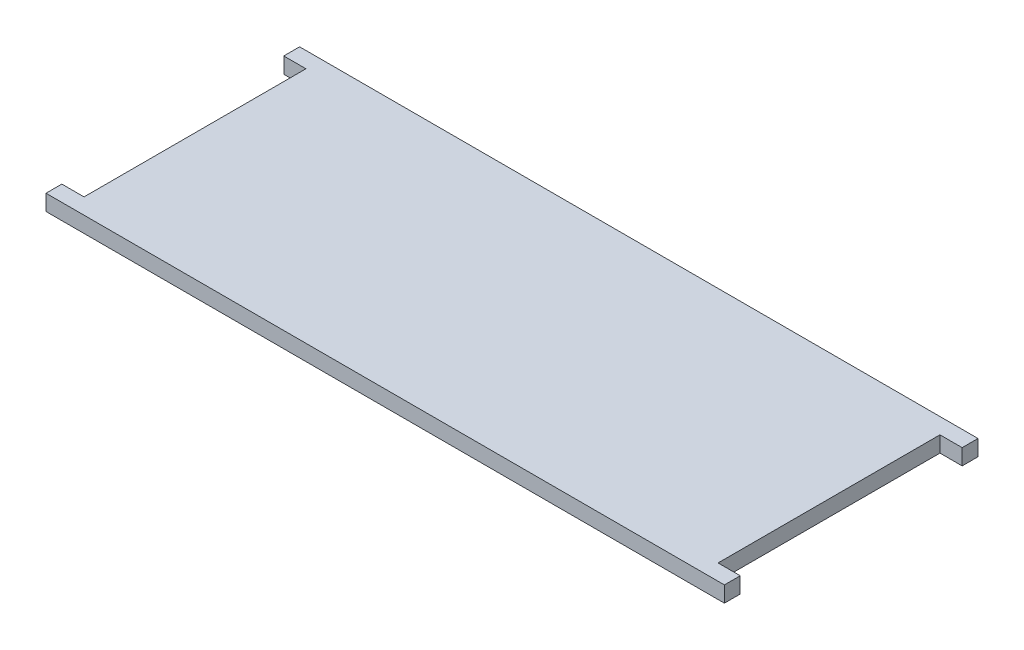
ISO-10303-21;
HEADER;
FILE_DESCRIPTION(('STEP AP214'),'2;1');
FILE_NAME('part.step','',(''),(''),'','','');
FILE_SCHEMA(('AUTOMOTIVE_DESIGN { 1 0 10303 214 1 1 1 1 }'));
ENDSEC;
DATA;
#1=APPLICATION_CONTEXT('core data for automotive mechanical design processes');
#2=APPLICATION_PROTOCOL_DEFINITION('international standard','automotive_design',2000,#1);
#3=PRODUCT_CONTEXT('',#1,'mechanical');
#4=PRODUCT('Part','Part','',(#3));
#5=PRODUCT_RELATED_PRODUCT_CATEGORY('part','',(#4));
#6=PRODUCT_DEFINITION_FORMATION('','',#4);
#7=PRODUCT_DEFINITION_CONTEXT('part definition',#1,'design');
#8=PRODUCT_DEFINITION('design','',#6,#7);
#9=PRODUCT_DEFINITION_SHAPE('','',#8);
#10=(LENGTH_UNIT() NAMED_UNIT(*) SI_UNIT(.MILLI.,.METRE.));
#11=(NAMED_UNIT(*) PLANE_ANGLE_UNIT() SI_UNIT($,.RADIAN.));
#12=(NAMED_UNIT(*) SI_UNIT($,.STERADIAN.) SOLID_ANGLE_UNIT());
#13=UNCERTAINTY_MEASURE_WITH_UNIT(LENGTH_MEASURE(1.E-05),#10,'distance_accuracy_value','');
#14=(GEOMETRIC_REPRESENTATION_CONTEXT(3) GLOBAL_UNCERTAINTY_ASSIGNED_CONTEXT((#13)) GLOBAL_UNIT_ASSIGNED_CONTEXT((#10,
#11,#12)) REPRESENTATION_CONTEXT('',''));
#15=CARTESIAN_POINT('',(0.,0.,0.));
#16=DIRECTION('',(0.,0.,1.));
#17=DIRECTION('',(1.,0.,0.));
#18=AXIS2_PLACEMENT_3D('',#15,#16,#17);
#19=CARTESIAN_POINT('',(63.5,3.175,0.));
#20=DIRECTION('',(1.,0.,0.));
#21=DIRECTION('',(0.,0.,-1.));
#22=AXIS2_PLACEMENT_3D('',#19,#20,#21);
#23=PLANE('',#22);
#24=DIRECTION('',(0.,0.,1.));
#25=VECTOR('',#24,1.);
#26=CARTESIAN_POINT('',(63.5,0.,0.));
#27=LINE('',#26,#25);
#28=CARTESIAN_POINT('',(63.5,0.,-22.225));
#29=VERTEX_POINT('',#28);
#30=CARTESIAN_POINT('',(63.5,0.,22.225));
#31=VERTEX_POINT('',#30);
#32=EDGE_CURVE('E163',#29,#31,#27,.T.);
#33=ORIENTED_EDGE('',*,*,#32,.F.);
#34=DIRECTION('',(0.,-1.,0.));
#35=VECTOR('',#34,1.);
#36=CARTESIAN_POINT('',(63.5,3.175,-22.225));
#37=LINE('',#36,#35);
#38=CARTESIAN_POINT('',(63.5,3.175,-22.225));
#39=VERTEX_POINT('',#38);
#40=EDGE_CURVE('E11',#39,#29,#37,.T.);
#41=ORIENTED_EDGE('',*,*,#40,.F.);
#42=DIRECTION('',(0.,0.,1.));
#43=VECTOR('',#42,1.);
#44=CARTESIAN_POINT('',(63.5,3.175,0.));
#45=LINE('',#44,#43);
#46=CARTESIAN_POINT('',(63.5,3.175,22.225));
#47=VERTEX_POINT('',#46);
#48=EDGE_CURVE('E206',#39,#47,#45,.T.);
#49=ORIENTED_EDGE('',*,*,#48,.T.);
#50=DIRECTION('',(0.,-1.,0.));
#51=VECTOR('',#50,1.);
#52=CARTESIAN_POINT('',(63.5,3.175,22.225));
#53=LINE('',#52,#51);
#54=EDGE_CURVE('E58',#47,#31,#53,.T.);
#55=ORIENTED_EDGE('',*,*,#54,.T.);
#56=EDGE_LOOP('',(#33,#41,#49,#55));
#57=FACE_BOUND('',#56,.T.);
#58=ADVANCED_FACE('F41',(#57),#23,.T.);
#59=CARTESIAN_POINT('',(0.,3.175,-22.225));
#60=DIRECTION('',(0.,0.,-1.));
#61=DIRECTION('',(-1.,0.,0.));
#62=AXIS2_PLACEMENT_3D('',#59,#60,#61);
#63=PLANE('',#62);
#64=DIRECTION('',(1.,0.,0.));
#65=VECTOR('',#64,1.);
#66=CARTESIAN_POINT('',(0.,0.,-22.225));
#67=LINE('',#66,#65);
#68=CARTESIAN_POINT('',(67.945,0.,-22.225));
#69=VERTEX_POINT('',#68);
#70=EDGE_CURVE('E166',#29,#69,#67,.T.);
#71=ORIENTED_EDGE('',*,*,#70,.T.);
#72=DIRECTION('',(0.,-1.,0.));
#73=VECTOR('',#72,1.);
#74=CARTESIAN_POINT('',(67.945,3.175,-22.225));
#75=LINE('',#74,#73);
#76=CARTESIAN_POINT('',(67.945,3.175,-22.225));
#77=VERTEX_POINT('',#76);
#78=EDGE_CURVE('E50',#77,#69,#75,.T.);
#79=ORIENTED_EDGE('',*,*,#78,.F.);
#80=DIRECTION('',(1.,0.,0.));
#81=VECTOR('',#80,1.);
#82=CARTESIAN_POINT('',(0.,3.175,-22.225));
#83=LINE('',#82,#81);
#84=EDGE_CURVE('E252',#39,#77,#83,.T.);
#85=ORIENTED_EDGE('',*,*,#84,.F.);
#86=ORIENTED_EDGE('',*,*,#40,.T.);
#87=EDGE_LOOP('',(#71,#79,#85,#86));
#88=FACE_BOUND('',#87,.T.);
#89=ADVANCED_FACE('F241',(#88),#63,.F.);
#90=CARTESIAN_POINT('',(67.945,3.175,0.));
#91=DIRECTION('',(1.,0.,0.));
#92=DIRECTION('',(0.,0.,-1.));
#93=AXIS2_PLACEMENT_3D('',#90,#91,#92);
#94=PLANE('',#93);
#95=DIRECTION('',(0.,0.,1.));
#96=VECTOR('',#95,1.);
#97=CARTESIAN_POINT('',(67.945,0.,0.));
#98=LINE('',#97,#96);
#99=CARTESIAN_POINT('',(67.945,0.,-25.4));
#100=VERTEX_POINT('',#99);
#101=EDGE_CURVE('E170',#100,#69,#98,.T.);
#102=ORIENTED_EDGE('',*,*,#101,.F.);
#103=DIRECTION('',(0.,-1.,0.));
#104=VECTOR('',#103,1.);
#105=CARTESIAN_POINT('',(67.945,3.175,-25.4));
#106=LINE('',#105,#104);
#107=CARTESIAN_POINT('',(67.945,3.175,-25.4));
#108=VERTEX_POINT('',#107);
#109=EDGE_CURVE('E229',#108,#100,#106,.T.);
#110=ORIENTED_EDGE('',*,*,#109,.F.);
#111=DIRECTION('',(0.,0.,1.));
#112=VECTOR('',#111,1.);
#113=CARTESIAN_POINT('',(67.945,3.175,0.));
#114=LINE('',#113,#112);
#115=EDGE_CURVE('E238',#108,#77,#114,.T.);
#116=ORIENTED_EDGE('',*,*,#115,.T.);
#117=ORIENTED_EDGE('',*,*,#78,.T.);
#118=EDGE_LOOP('',(#102,#110,#116,#117));
#119=FACE_BOUND('',#118,.T.);
#120=ADVANCED_FACE('F236',(#119),#94,.T.);
#121=CARTESIAN_POINT('',(0.,3.175,-25.4));
#122=DIRECTION('',(0.,0.,-1.));
#123=DIRECTION('',(-1.,0.,0.));
#124=AXIS2_PLACEMENT_3D('',#121,#122,#123);
#125=PLANE('',#124);
#126=DIRECTION('',(1.,0.,0.));
#127=VECTOR('',#126,1.);
#128=CARTESIAN_POINT('',(0.,0.,-25.4));
#129=LINE('',#128,#127);
#130=CARTESIAN_POINT('',(-67.945,0.,-25.4));
#131=VERTEX_POINT('',#130);
#132=EDGE_CURVE('E174',#131,#100,#129,.T.);
#133=ORIENTED_EDGE('',*,*,#132,.F.);
#134=DIRECTION('',(0.,-1.,0.));
#135=VECTOR('',#134,1.);
#136=CARTESIAN_POINT('',(-67.945,3.175,-25.4));
#137=LINE('',#136,#135);
#138=CARTESIAN_POINT('',(-67.945,3.175,-25.4));
#139=VERTEX_POINT('',#138);
#140=EDGE_CURVE('E226',#139,#131,#137,.T.);
#141=ORIENTED_EDGE('',*,*,#140,.F.);
#142=DIRECTION('',(1.,0.,0.));
#143=VECTOR('',#142,1.);
#144=CARTESIAN_POINT('',(0.,3.175,-25.4));
#145=LINE('',#144,#143);
#146=EDGE_CURVE('E251',#139,#108,#145,.T.);
#147=ORIENTED_EDGE('',*,*,#146,.T.);
#148=ORIENTED_EDGE('',*,*,#109,.T.);
#149=EDGE_LOOP('',(#133,#141,#147,#148));
#150=FACE_BOUND('',#149,.T.);
#151=ADVANCED_FACE('F247',(#150),#125,.T.);
#152=CARTESIAN_POINT('',(-67.945,3.175,0.));
#153=DIRECTION('',(1.,0.,0.));
#154=DIRECTION('',(0.,0.,-1.));
#155=AXIS2_PLACEMENT_3D('',#152,#153,#154);
#156=PLANE('',#155);
#157=DIRECTION('',(0.,0.,1.));
#158=VECTOR('',#157,1.);
#159=CARTESIAN_POINT('',(-67.945,0.,0.));
#160=LINE('',#159,#158);
#161=CARTESIAN_POINT('',(-67.945,0.,-22.225));
#162=VERTEX_POINT('',#161);
#163=EDGE_CURVE('E178',#131,#162,#160,.T.);
#164=ORIENTED_EDGE('',*,*,#163,.T.);
#165=DIRECTION('',(0.,-1.,0.));
#166=VECTOR('',#165,1.);
#167=CARTESIAN_POINT('',(-67.945,3.175,-22.225));
#168=LINE('',#167,#166);
#169=CARTESIAN_POINT('',(-67.945,3.175,-22.225));
#170=VERTEX_POINT('',#169);
#171=EDGE_CURVE('E223',#170,#162,#168,.T.);
#172=ORIENTED_EDGE('',*,*,#171,.F.);
#173=DIRECTION('',(0.,0.,1.));
#174=VECTOR('',#173,1.);
#175=CARTESIAN_POINT('',(-67.945,3.175,0.));
#176=LINE('',#175,#174);
#177=EDGE_CURVE('E257',#139,#170,#176,.T.);
#178=ORIENTED_EDGE('',*,*,#177,.F.);
#179=ORIENTED_EDGE('',*,*,#140,.T.);
#180=EDGE_LOOP('',(#164,#172,#178,#179));
#181=FACE_BOUND('',#180,.T.);
#182=ADVANCED_FACE('F300',(#181),#156,.F.);
#183=CARTESIAN_POINT('',(0.,3.175,-22.225));
#184=DIRECTION('',(0.,0.,1.));
#185=DIRECTION('',(1.,0.,0.));
#186=AXIS2_PLACEMENT_3D('',#183,#184,#185);
#187=PLANE('',#186);
#188=DIRECTION('',(-1.,0.,0.));
#189=VECTOR('',#188,1.);
#190=CARTESIAN_POINT('',(0.,0.,-22.225));
#191=LINE('',#190,#189);
#192=CARTESIAN_POINT('',(-63.5,0.,-22.225));
#193=VERTEX_POINT('',#192);
#194=EDGE_CURVE('E182',#193,#162,#191,.T.);
#195=ORIENTED_EDGE('',*,*,#194,.F.);
#196=DIRECTION('',(0.,-1.,0.));
#197=VECTOR('',#196,1.);
#198=CARTESIAN_POINT('',(-63.5,3.175,-22.225));
#199=LINE('',#198,#197);
#200=CARTESIAN_POINT('',(-63.5,3.175,-22.225));
#201=VERTEX_POINT('',#200);
#202=EDGE_CURVE('E220',#201,#193,#199,.T.);
#203=ORIENTED_EDGE('',*,*,#202,.F.);
#204=DIRECTION('',(-1.,0.,0.));
#205=VECTOR('',#204,1.);
#206=CARTESIAN_POINT('',(0.,3.175,-22.225));
#207=LINE('',#206,#205);
#208=EDGE_CURVE('E264',#201,#170,#207,.T.);
#209=ORIENTED_EDGE('',*,*,#208,.T.);
#210=ORIENTED_EDGE('',*,*,#171,.T.);
#211=EDGE_LOOP('',(#195,#203,#209,#210));
#212=FACE_BOUND('',#211,.T.);
#213=ADVANCED_FACE('F303',(#212),#187,.T.);
#214=CARTESIAN_POINT('',(-63.5,3.175,0.));
#215=DIRECTION('',(1.,0.,0.));
#216=DIRECTION('',(0.,0.,-1.));
#217=AXIS2_PLACEMENT_3D('',#214,#215,#216);
#218=PLANE('',#217);
#219=DIRECTION('',(0.,0.,1.));
#220=VECTOR('',#219,1.);
#221=CARTESIAN_POINT('',(-63.5,0.,0.));
#222=LINE('',#221,#220);
#223=CARTESIAN_POINT('',(-63.5,0.,22.225));
#224=VERTEX_POINT('',#223);
#225=EDGE_CURVE('E186',#193,#224,#222,.T.);
#226=ORIENTED_EDGE('',*,*,#225,.T.);
#227=DIRECTION('',(0.,-1.,0.));
#228=VECTOR('',#227,1.);
#229=CARTESIAN_POINT('',(-63.5,3.175,22.225));
#230=LINE('',#229,#228);
#231=CARTESIAN_POINT('',(-63.5,3.175,22.225));
#232=VERTEX_POINT('',#231);
#233=EDGE_CURVE('E216',#232,#224,#230,.T.);
#234=ORIENTED_EDGE('',*,*,#233,.F.);
#235=DIRECTION('',(0.,0.,1.));
#236=VECTOR('',#235,1.);
#237=CARTESIAN_POINT('',(-63.5,3.175,0.));
#238=LINE('',#237,#236);
#239=EDGE_CURVE('E268',#201,#232,#238,.T.);
#240=ORIENTED_EDGE('',*,*,#239,.F.);
#241=ORIENTED_EDGE('',*,*,#202,.T.);
#242=EDGE_LOOP('',(#226,#234,#240,#241));
#243=FACE_BOUND('',#242,.T.);
#244=ADVANCED_FACE('F307',(#243),#218,.F.);
#245=CARTESIAN_POINT('',(0.,3.175,22.225));
#246=DIRECTION('',(0.,0.,1.));
#247=DIRECTION('',(1.,0.,0.));
#248=AXIS2_PLACEMENT_3D('',#245,#246,#247);
#249=PLANE('',#248);
#250=DIRECTION('',(-1.,0.,0.));
#251=VECTOR('',#250,1.);
#252=CARTESIAN_POINT('',(0.,0.,22.225));
#253=LINE('',#252,#251);
#254=CARTESIAN_POINT('',(-67.9449999999999,0.,22.225));
#255=VERTEX_POINT('',#254);
#256=EDGE_CURVE('E189',#224,#255,#253,.T.);
#257=ORIENTED_EDGE('',*,*,#256,.T.);
#258=DIRECTION('',(0.,-1.,0.));
#259=VECTOR('',#258,1.);
#260=CARTESIAN_POINT('',(-67.9449999999999,3.175,22.225));
#261=LINE('',#260,#259);
#262=CARTESIAN_POINT('',(-67.9449999999999,3.175,22.225));
#263=VERTEX_POINT('',#262);
#264=EDGE_CURVE('E213',#263,#255,#261,.T.);
#265=ORIENTED_EDGE('',*,*,#264,.F.);
#266=DIRECTION('',(-1.,0.,0.));
#267=VECTOR('',#266,1.);
#268=CARTESIAN_POINT('',(0.,3.175,22.225));
#269=LINE('',#268,#267);
#270=EDGE_CURVE('E271',#232,#263,#269,.T.);
#271=ORIENTED_EDGE('',*,*,#270,.F.);
#272=ORIENTED_EDGE('',*,*,#233,.T.);
#273=EDGE_LOOP('',(#257,#265,#271,#272));
#274=FACE_BOUND('',#273,.T.);
#275=ADVANCED_FACE('F311',(#274),#249,.F.);
#276=CARTESIAN_POINT('',(-67.9449999999998,3.175,-2.96984659087232E-13));
#277=DIRECTION('',(-1.,0.,0.));
#278=DIRECTION('',(0.,0.,1.));
#279=AXIS2_PLACEMENT_3D('',#276,#277,#278);
#280=PLANE('',#279);
#281=DIRECTION('',(0.,0.,-1.));
#282=VECTOR('',#281,1.);
#283=CARTESIAN_POINT('',(-67.9449999999998,0.,-2.96984659087232E-13));
#284=LINE('',#283,#282);
#285=CARTESIAN_POINT('',(-67.945,0.,25.4));
#286=VERTEX_POINT('',#285);
#287=EDGE_CURVE('E193',#286,#255,#284,.T.);
#288=ORIENTED_EDGE('',*,*,#287,.F.);
#289=DIRECTION('',(0.,-1.,0.));
#290=VECTOR('',#289,1.);
#291=CARTESIAN_POINT('',(-67.945,3.175,25.4));
#292=LINE('',#291,#290);
#293=CARTESIAN_POINT('',(-67.945,3.175,25.4));
#294=VERTEX_POINT('',#293);
#295=EDGE_CURVE('E153',#294,#286,#292,.T.);
#296=ORIENTED_EDGE('',*,*,#295,.F.);
#297=DIRECTION('',(0.,0.,-1.));
#298=VECTOR('',#297,1.);
#299=CARTESIAN_POINT('',(-67.9449999999998,3.175,-2.96984659087232E-13));
#300=LINE('',#299,#298);
#301=EDGE_CURVE('E141',#294,#263,#300,.T.);
#302=ORIENTED_EDGE('',*,*,#301,.T.);
#303=ORIENTED_EDGE('',*,*,#264,.T.);
#304=EDGE_LOOP('',(#288,#296,#302,#303));
#305=FACE_BOUND('',#304,.T.);
#306=ADVANCED_FACE('F276',(#305),#280,.T.);
#307=CARTESIAN_POINT('',(0.,3.175,25.4));
#308=DIRECTION('',(0.,0.,-1.));
#309=DIRECTION('',(-1.,0.,0.));
#310=AXIS2_PLACEMENT_3D('',#307,#308,#309);
#311=PLANE('',#310);
#312=DIRECTION('',(1.,0.,0.));
#313=VECTOR('',#312,1.);
#314=CARTESIAN_POINT('',(0.,0.,25.4));
#315=LINE('',#314,#313);
#316=CARTESIAN_POINT('',(67.945,0.,25.4));
#317=VERTEX_POINT('',#316);
#318=EDGE_CURVE('E149',#286,#317,#315,.T.);
#319=ORIENTED_EDGE('',*,*,#318,.T.);
#320=DIRECTION('',(0.,-1.,0.));
#321=VECTOR('',#320,1.);
#322=CARTESIAN_POINT('',(67.945,3.175,25.4));
#323=LINE('',#322,#321);
#324=CARTESIAN_POINT('',(67.945,3.175,25.4));
#325=VERTEX_POINT('',#324);
#326=EDGE_CURVE('E146',#325,#317,#323,.T.);
#327=ORIENTED_EDGE('',*,*,#326,.F.);
#328=DIRECTION('',(1.,0.,0.));
#329=VECTOR('',#328,1.);
#330=CARTESIAN_POINT('',(0.,3.175,25.4));
#331=LINE('',#330,#329);
#332=EDGE_CURVE('E133',#294,#325,#331,.T.);
#333=ORIENTED_EDGE('',*,*,#332,.F.);
#334=ORIENTED_EDGE('',*,*,#295,.T.);
#335=EDGE_LOOP('',(#319,#327,#333,#334));
#336=FACE_BOUND('',#335,.T.);
#337=ADVANCED_FACE('F147',(#336),#311,.F.);
#338=CARTESIAN_POINT('',(67.9450000000001,3.175,2.96984659087232E-13));
#339=DIRECTION('',(-1.,0.,0.));
#340=DIRECTION('',(0.,0.,1.));
#341=AXIS2_PLACEMENT_3D('',#338,#339,#340);
#342=PLANE('',#341);
#343=DIRECTION('',(0.,0.,-1.));
#344=VECTOR('',#343,1.);
#345=CARTESIAN_POINT('',(67.9450000000001,0.,2.96984659087232E-13));
#346=LINE('',#345,#344);
#347=CARTESIAN_POINT('',(67.9450000000001,0.,22.225));
#348=VERTEX_POINT('',#347);
#349=EDGE_CURVE('E199',#317,#348,#346,.T.);
#350=ORIENTED_EDGE('',*,*,#349,.T.);
#351=DIRECTION('',(0.,-1.,0.));
#352=VECTOR('',#351,1.);
#353=CARTESIAN_POINT('',(67.9450000000001,3.175,22.225));
#354=LINE('',#353,#352);
#355=CARTESIAN_POINT('',(67.9450000000001,3.175,22.225));
#356=VERTEX_POINT('',#355);
#357=EDGE_CURVE('E96',#356,#348,#354,.T.);
#358=ORIENTED_EDGE('',*,*,#357,.F.);
#359=DIRECTION('',(0.,0.,-1.));
#360=VECTOR('',#359,1.);
#361=CARTESIAN_POINT('',(67.9450000000001,3.175,2.96984659087232E-13));
#362=LINE('',#361,#360);
#363=EDGE_CURVE('E139',#325,#356,#362,.T.);
#364=ORIENTED_EDGE('',*,*,#363,.F.);
#365=ORIENTED_EDGE('',*,*,#326,.T.);
#366=EDGE_LOOP('',(#350,#358,#364,#365));
#367=FACE_BOUND('',#366,.T.);
#368=ADVANCED_FACE('F155',(#367),#342,.F.);
#369=CARTESIAN_POINT('',(0.,3.175,22.225));
#370=DIRECTION('',(0.,0.,-1.));
#371=DIRECTION('',(-1.,0.,0.));
#372=AXIS2_PLACEMENT_3D('',#369,#370,#371);
#373=PLANE('',#372);
#374=DIRECTION('',(1.,0.,0.));
#375=VECTOR('',#374,1.);
#376=CARTESIAN_POINT('',(0.,0.,22.225));
#377=LINE('',#376,#375);
#378=EDGE_CURVE('E202',#31,#348,#377,.T.);
#379=ORIENTED_EDGE('',*,*,#378,.F.);
#380=ORIENTED_EDGE('',*,*,#54,.F.);
#381=DIRECTION('',(1.,0.,0.));
#382=VECTOR('',#381,1.);
#383=CARTESIAN_POINT('',(0.,3.175,22.225));
#384=LINE('',#383,#382);
#385=EDGE_CURVE('E157',#47,#356,#384,.T.);
#386=ORIENTED_EDGE('',*,*,#385,.T.);
#387=ORIENTED_EDGE('',*,*,#357,.T.);
#388=EDGE_LOOP('',(#379,#380,#386,#387));
#389=FACE_BOUND('',#388,.T.);
#390=ADVANCED_FACE('F279',(#389),#373,.T.);
#391=CARTESIAN_POINT('',(0.,3.175,0.));
#392=DIRECTION('',(0.,1.,0.));
#393=DIRECTION('',(0.,0.,1.));
#394=AXIS2_PLACEMENT_3D('',#391,#392,#393);
#395=PLANE('',#394);
#396=ORIENTED_EDGE('',*,*,#48,.F.);
#397=ORIENTED_EDGE('',*,*,#84,.T.);
#398=ORIENTED_EDGE('',*,*,#115,.F.);
#399=ORIENTED_EDGE('',*,*,#146,.F.);
#400=ORIENTED_EDGE('',*,*,#177,.T.);
#401=ORIENTED_EDGE('',*,*,#208,.F.);
#402=ORIENTED_EDGE('',*,*,#239,.T.);
#403=ORIENTED_EDGE('',*,*,#270,.T.);
#404=ORIENTED_EDGE('',*,*,#301,.F.);
#405=ORIENTED_EDGE('',*,*,#332,.T.);
#406=ORIENTED_EDGE('',*,*,#363,.T.);
#407=ORIENTED_EDGE('',*,*,#385,.F.);
#408=EDGE_LOOP('',(#396,#397,#398,#399,#400,#401,#402,#403,#404,#405,#406,#407));
#409=FACE_BOUND('',#408,.T.);
#410=ADVANCED_FACE('F136',(#409),#395,.T.);
#411=CARTESIAN_POINT('',(0.,0.,0.));
#412=DIRECTION('',(0.,1.,0.));
#413=DIRECTION('',(0.,0.,1.));
#414=AXIS2_PLACEMENT_3D('',#411,#412,#413);
#415=PLANE('',#414);
#416=ORIENTED_EDGE('',*,*,#32,.T.);
#417=ORIENTED_EDGE('',*,*,#378,.T.);
#418=ORIENTED_EDGE('',*,*,#349,.F.);
#419=ORIENTED_EDGE('',*,*,#318,.F.);
#420=ORIENTED_EDGE('',*,*,#287,.T.);
#421=ORIENTED_EDGE('',*,*,#256,.F.);
#422=ORIENTED_EDGE('',*,*,#225,.F.);
#423=ORIENTED_EDGE('',*,*,#194,.T.);
#424=ORIENTED_EDGE('',*,*,#163,.F.);
#425=ORIENTED_EDGE('',*,*,#132,.T.);
#426=ORIENTED_EDGE('',*,*,#101,.T.);
#427=ORIENTED_EDGE('',*,*,#70,.F.);
#428=EDGE_LOOP('',(#416,#417,#418,#419,#420,#421,#422,#423,#424,#425,#426,#427));
#429=FACE_BOUND('',#428,.T.);
#430=ADVANCED_FACE('F243',(#429),#415,.F.);
#431=CLOSED_SHELL('',(#58,#89,#120,#151,#182,#213,#244,#275,#306,#337,#368,#390,#410,#430));
#432=MANIFOLD_SOLID_BREP('B2',#431);
#433=ADVANCED_BREP_SHAPE_REPRESENTATION('',(#18,#432),#14);
#434=SHAPE_DEFINITION_REPRESENTATION(#9,#433);
ENDSEC;
END-ISO-10303-21;
